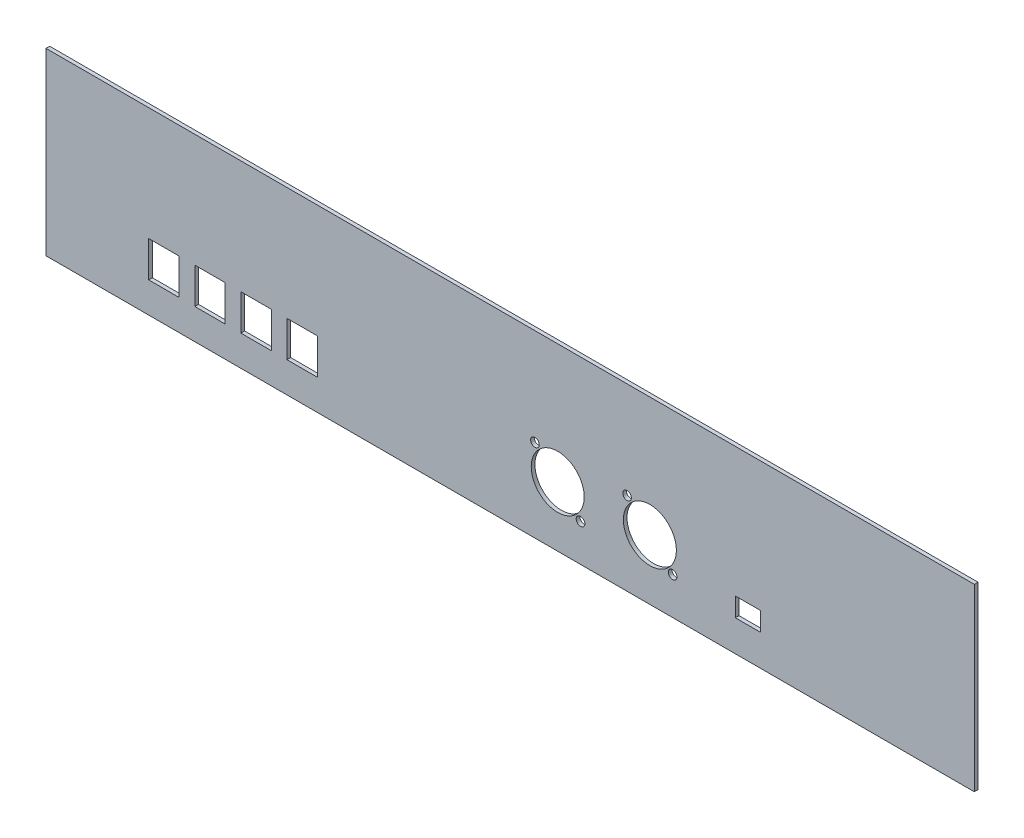
ISO-10303-21;
HEADER;
FILE_DESCRIPTION(('STEP AP214'),'2;1');
FILE_NAME('part.step','',(''),(''),'','','');
FILE_SCHEMA(('AUTOMOTIVE_DESIGN { 1 0 10303 214 1 1 1 1 }'));
ENDSEC;
DATA;
#1=APPLICATION_CONTEXT('core data for automotive mechanical design processes');
#2=APPLICATION_PROTOCOL_DEFINITION('international standard','automotive_design',2000,#1);
#3=PRODUCT_CONTEXT('',#1,'mechanical');
#4=PRODUCT('Part','Part','',(#3));
#5=PRODUCT_RELATED_PRODUCT_CATEGORY('part','',(#4));
#6=PRODUCT_DEFINITION_FORMATION('','',#4);
#7=PRODUCT_DEFINITION_CONTEXT('part definition',#1,'design');
#8=PRODUCT_DEFINITION('design','',#6,#7);
#9=PRODUCT_DEFINITION_SHAPE('','',#8);
#10=(LENGTH_UNIT() NAMED_UNIT(*) SI_UNIT(.MILLI.,.METRE.));
#11=(NAMED_UNIT(*) PLANE_ANGLE_UNIT() SI_UNIT($,.RADIAN.));
#12=(NAMED_UNIT(*) SI_UNIT($,.STERADIAN.) SOLID_ANGLE_UNIT());
#13=UNCERTAINTY_MEASURE_WITH_UNIT(LENGTH_MEASURE(1.E-05),#10,'distance_accuracy_value','');
#14=(GEOMETRIC_REPRESENTATION_CONTEXT(3) GLOBAL_UNCERTAINTY_ASSIGNED_CONTEXT((#13)) GLOBAL_UNIT_ASSIGNED_CONTEXT((#10,
#11,#12)) REPRESENTATION_CONTEXT('',''));
#15=CARTESIAN_POINT('',(0.,0.,0.));
#16=DIRECTION('',(0.,0.,1.));
#17=DIRECTION('',(1.,0.,0.));
#18=AXIS2_PLACEMENT_3D('',#15,#16,#17);
#19=CARTESIAN_POINT('',(0.,0.,1.6));
#20=DIRECTION('',(0.,0.,-1.));
#21=DIRECTION('',(-1.,0.,0.));
#22=AXIS2_PLACEMENT_3D('',#19,#20,#21);
#23=PLANE('',#22);
#24=DIRECTION('',(1.,0.,0.));
#25=VECTOR('',#24,1.);
#26=CARTESIAN_POINT('',(44.6,28.8,1.6));
#27=LINE('',#26,#25);
#28=CARTESIAN_POINT('',(44.6,28.8,1.6));
#29=VERTEX_POINT('',#28);
#30=CARTESIAN_POINT('',(57.8,28.8,1.6));
#31=VERTEX_POINT('',#30);
#32=EDGE_CURVE('E231',#29,#31,#27,.T.);
#33=ORIENTED_EDGE('',*,*,#32,.T.);
#34=DIRECTION('',(0.,-1.,0.));
#35=VECTOR('',#34,1.);
#36=CARTESIAN_POINT('',(57.8,28.8,1.6));
#37=LINE('',#36,#35);
#38=CARTESIAN_POINT('',(57.8,13.25,1.6));
#39=VERTEX_POINT('',#38);
#40=EDGE_CURVE('E227',#31,#39,#37,.T.);
#41=ORIENTED_EDGE('',*,*,#40,.T.);
#42=DIRECTION('',(-1.,0.,0.));
#43=VECTOR('',#42,1.);
#44=CARTESIAN_POINT('',(44.6,13.25,1.6));
#45=LINE('',#44,#43);
#46=CARTESIAN_POINT('',(44.6,13.25,1.6));
#47=VERTEX_POINT('',#46);
#48=EDGE_CURVE('E230',#39,#47,#45,.T.);
#49=ORIENTED_EDGE('',*,*,#48,.T.);
#50=DIRECTION('',(0.,1.,0.));
#51=VECTOR('',#50,1.);
#52=CARTESIAN_POINT('',(44.6,28.8,1.6));
#53=LINE('',#52,#51);
#54=EDGE_CURVE('E234',#47,#29,#53,.T.);
#55=ORIENTED_EDGE('',*,*,#54,.T.);
#56=EDGE_LOOP('',(#33,#41,#49,#55));
#57=FACE_BOUND('',#56,.T.);
#58=DIRECTION('',(1.,0.,0.));
#59=VECTOR('',#58,1.);
#60=CARTESIAN_POINT('',(84.6,28.8,1.6));
#61=LINE('',#60,#59);
#62=CARTESIAN_POINT('',(84.6,28.8,1.6));
#63=VERTEX_POINT('',#62);
#64=CARTESIAN_POINT('',(97.8,28.8,1.6));
#65=VERTEX_POINT('',#64);
#66=EDGE_CURVE('E299',#63,#65,#61,.T.);
#67=ORIENTED_EDGE('',*,*,#66,.T.);
#68=DIRECTION('',(0.,-1.,0.));
#69=VECTOR('',#68,1.);
#70=CARTESIAN_POINT('',(97.8,28.8,1.6));
#71=LINE('',#70,#69);
#72=CARTESIAN_POINT('',(97.8,13.25,1.6));
#73=VERTEX_POINT('',#72);
#74=EDGE_CURVE('E295',#65,#73,#71,.T.);
#75=ORIENTED_EDGE('',*,*,#74,.T.);
#76=DIRECTION('',(-1.,0.,0.));
#77=VECTOR('',#76,1.);
#78=CARTESIAN_POINT('',(84.6,13.25,1.6));
#79=LINE('',#78,#77);
#80=CARTESIAN_POINT('',(84.6,13.25,1.6));
#81=VERTEX_POINT('',#80);
#82=EDGE_CURVE('E298',#73,#81,#79,.T.);
#83=ORIENTED_EDGE('',*,*,#82,.T.);
#84=DIRECTION('',(0.,1.,0.));
#85=VECTOR('',#84,1.);
#86=CARTESIAN_POINT('',(84.6,28.8,1.6));
#87=LINE('',#86,#85);
#88=EDGE_CURVE('E275',#81,#63,#87,.T.);
#89=ORIENTED_EDGE('',*,*,#88,.T.);
#90=EDGE_LOOP('',(#67,#75,#83,#89));
#91=FACE_BOUND('',#90,.T.);
#92=DIRECTION('',(0.,-1.,0.));
#93=VECTOR('',#92,1.);
#94=CARTESIAN_POINT('',(0.,0.,1.6));
#95=LINE('',#94,#93);
#96=CARTESIAN_POINT('',(0.,78.,1.6));
#97=VERTEX_POINT('',#96);
#98=CARTESIAN_POINT('',(0.,0.,1.6));
#99=VERTEX_POINT('',#98);
#100=EDGE_CURVE('E397',#97,#99,#95,.T.);
#101=ORIENTED_EDGE('',*,*,#100,.T.);
#102=DIRECTION('',(1.,0.,0.));
#103=VECTOR('',#102,1.);
#104=CARTESIAN_POINT('',(0.,0.,1.6));
#105=LINE('',#104,#103);
#106=CARTESIAN_POINT('',(403.,0.,1.6));
#107=VERTEX_POINT('',#106);
#108=EDGE_CURVE('E400',#99,#107,#105,.T.);
#109=ORIENTED_EDGE('',*,*,#108,.T.);
#110=DIRECTION('',(0.,1.,0.));
#111=VECTOR('',#110,1.);
#112=CARTESIAN_POINT('',(403.,0.,1.6));
#113=LINE('',#112,#111);
#114=CARTESIAN_POINT('',(403.,78.,1.6));
#115=VERTEX_POINT('',#114);
#116=EDGE_CURVE('E403',#107,#115,#113,.T.);
#117=ORIENTED_EDGE('',*,*,#116,.T.);
#118=DIRECTION('',(-1.,0.,0.));
#119=VECTOR('',#118,1.);
#120=CARTESIAN_POINT('',(0.,78.,1.6));
#121=LINE('',#120,#119);
#122=EDGE_CURVE('E405',#115,#97,#121,.T.);
#123=ORIENTED_EDGE('',*,*,#122,.T.);
#124=EDGE_LOOP('',(#101,#109,#117,#123));
#125=FACE_BOUND('',#124,.T.);
#126=CARTESIAN_POINT('',(222.15,26.1,1.6));
#127=DIRECTION('',(0.,0.,-1.));
#128=DIRECTION('',(-1.,0.,0.));
#129=AXIS2_PLACEMENT_3D('',#126,#127,#128);
#130=CIRCLE('',#129,11.5);
#131=CARTESIAN_POINT('',(210.65,26.1,1.6));
#132=VERTEX_POINT('',#131);
#133=EDGE_CURVE('E393',#132,#132,#130,.T.);
#134=ORIENTED_EDGE('',*,*,#133,.T.);
#135=EDGE_LOOP('',(#134));
#136=FACE_BOUND('',#135,.T.);
#137=CARTESIAN_POINT('',(272.05,16.2,1.6));
#138=DIRECTION('',(0.,0.,-1.));
#139=DIRECTION('',(-1.,0.,0.));
#140=AXIS2_PLACEMENT_3D('',#137,#138,#139);
#141=CIRCLE('',#140,1.87499999999999);
#142=CARTESIAN_POINT('',(270.175,16.2,1.6));
#143=VERTEX_POINT('',#142);
#144=EDGE_CURVE('E363',#143,#143,#141,.T.);
#145=ORIENTED_EDGE('',*,*,#144,.T.);
#146=EDGE_LOOP('',(#145));
#147=FACE_BOUND('',#146,.T.);
#148=CARTESIAN_POINT('',(262.15,26.1,1.6));
#149=DIRECTION('',(0.,0.,-1.));
#150=DIRECTION('',(-1.,0.,0.));
#151=AXIS2_PLACEMENT_3D('',#148,#149,#150);
#152=CIRCLE('',#151,11.5);
#153=CARTESIAN_POINT('',(250.65,26.1,1.6));
#154=VERTEX_POINT('',#153);
#155=EDGE_CURVE('E378',#154,#154,#152,.T.);
#156=ORIENTED_EDGE('',*,*,#155,.T.);
#157=EDGE_LOOP('',(#156));
#158=FACE_BOUND('',#157,.T.);
#159=CARTESIAN_POINT('',(252.25,36.,1.6));
#160=DIRECTION('',(0.,0.,-1.));
#161=DIRECTION('',(-1.,0.,0.));
#162=AXIS2_PLACEMENT_3D('',#159,#160,#161);
#163=CIRCLE('',#162,1.87499999999999);
#164=CARTESIAN_POINT('',(250.375,36.,1.6));
#165=VERTEX_POINT('',#164);
#166=EDGE_CURVE('E383',#165,#165,#163,.T.);
#167=ORIENTED_EDGE('',*,*,#166,.T.);
#168=EDGE_LOOP('',(#167));
#169=FACE_BOUND('',#168,.T.);
#170=CARTESIAN_POINT('',(232.05,16.2,1.6));
#171=DIRECTION('',(0.,0.,-1.));
#172=DIRECTION('',(-1.,0.,0.));
#173=AXIS2_PLACEMENT_3D('',#170,#171,#172);
#174=CIRCLE('',#173,1.87499999999999);
#175=CARTESIAN_POINT('',(230.175,16.2,1.6));
#176=VERTEX_POINT('',#175);
#177=EDGE_CURVE('E371',#176,#176,#174,.T.);
#178=ORIENTED_EDGE('',*,*,#177,.T.);
#179=EDGE_LOOP('',(#178));
#180=FACE_BOUND('',#179,.T.);
#181=CARTESIAN_POINT('',(212.25,36.,1.6));
#182=DIRECTION('',(0.,0.,-1.));
#183=DIRECTION('',(-1.,0.,0.));
#184=AXIS2_PLACEMENT_3D('',#181,#182,#183);
#185=CIRCLE('',#184,1.87499999999999);
#186=CARTESIAN_POINT('',(210.375,36.,1.6));
#187=VERTEX_POINT('',#186);
#188=EDGE_CURVE('E370',#187,#187,#185,.T.);
#189=ORIENTED_EDGE('',*,*,#188,.T.);
#190=EDGE_LOOP('',(#189));
#191=FACE_BOUND('',#190,.T.);
#192=DIRECTION('',(1.,0.,0.));
#193=VECTOR('',#192,1.);
#194=CARTESIAN_POINT('',(104.6,28.8,1.6));
#195=LINE('',#194,#193);
#196=CARTESIAN_POINT('',(104.6,28.8,1.6));
#197=VERTEX_POINT('',#196);
#198=CARTESIAN_POINT('',(117.8,28.8,1.6));
#199=VERTEX_POINT('',#198);
#200=EDGE_CURVE('E332',#197,#199,#195,.T.);
#201=ORIENTED_EDGE('',*,*,#200,.T.);
#202=DIRECTION('',(0.,-1.,0.));
#203=VECTOR('',#202,1.);
#204=CARTESIAN_POINT('',(117.8,28.8,1.6));
#205=LINE('',#204,#203);
#206=CARTESIAN_POINT('',(117.8,13.25,1.6));
#207=VERTEX_POINT('',#206);
#208=EDGE_CURVE('E328',#199,#207,#205,.T.);
#209=ORIENTED_EDGE('',*,*,#208,.T.);
#210=DIRECTION('',(-1.,0.,0.));
#211=VECTOR('',#210,1.);
#212=CARTESIAN_POINT('',(104.6,13.25,1.6));
#213=LINE('',#212,#211);
#214=CARTESIAN_POINT('',(104.6,13.25,1.6));
#215=VERTEX_POINT('',#214);
#216=EDGE_CURVE('E331',#207,#215,#213,.T.);
#217=ORIENTED_EDGE('',*,*,#216,.T.);
#218=DIRECTION('',(0.,1.,0.));
#219=VECTOR('',#218,1.);
#220=CARTESIAN_POINT('',(104.6,28.8,1.6));
#221=LINE('',#220,#219);
#222=EDGE_CURVE('E308',#215,#197,#221,.T.);
#223=ORIENTED_EDGE('',*,*,#222,.T.);
#224=EDGE_LOOP('',(#201,#209,#217,#223));
#225=FACE_BOUND('',#224,.T.);
#226=DIRECTION('',(1.,0.,0.));
#227=VECTOR('',#226,1.);
#228=CARTESIAN_POINT('',(64.6,28.8,1.6));
#229=LINE('',#228,#227);
#230=CARTESIAN_POINT('',(64.6,28.8,1.6));
#231=VERTEX_POINT('',#230);
#232=CARTESIAN_POINT('',(77.8,28.8,1.6));
#233=VERTEX_POINT('',#232);
#234=EDGE_CURVE('E266',#231,#233,#229,.T.);
#235=ORIENTED_EDGE('',*,*,#234,.T.);
#236=DIRECTION('',(0.,-1.,0.));
#237=VECTOR('',#236,1.);
#238=CARTESIAN_POINT('',(77.8,28.8,1.6));
#239=LINE('',#238,#237);
#240=CARTESIAN_POINT('',(77.8,13.25,1.6));
#241=VERTEX_POINT('',#240);
#242=EDGE_CURVE('E262',#233,#241,#239,.T.);
#243=ORIENTED_EDGE('',*,*,#242,.T.);
#244=DIRECTION('',(-1.,0.,0.));
#245=VECTOR('',#244,1.);
#246=CARTESIAN_POINT('',(64.6,13.25,1.6));
#247=LINE('',#246,#245);
#248=CARTESIAN_POINT('',(64.6,13.25,1.6));
#249=VERTEX_POINT('',#248);
#250=EDGE_CURVE('E265',#241,#249,#247,.T.);
#251=ORIENTED_EDGE('',*,*,#250,.T.);
#252=DIRECTION('',(0.,1.,0.));
#253=VECTOR('',#252,1.);
#254=CARTESIAN_POINT('',(64.6,28.8,1.6));
#255=LINE('',#254,#253);
#256=EDGE_CURVE('E242',#249,#231,#255,.T.);
#257=ORIENTED_EDGE('',*,*,#256,.T.);
#258=EDGE_LOOP('',(#235,#243,#251,#257));
#259=FACE_BOUND('',#258,.T.);
#260=DIRECTION('',(1.,0.,0.));
#261=VECTOR('',#260,1.);
#262=CARTESIAN_POINT('',(299.25,21.75,1.6));
#263=LINE('',#262,#261);
#264=CARTESIAN_POINT('',(299.25,21.75,1.6));
#265=VERTEX_POINT('',#264);
#266=CARTESIAN_POINT('',(310.1,21.75,1.6));
#267=VERTEX_POINT('',#266);
#268=EDGE_CURVE('E223',#265,#267,#263,.T.);
#269=ORIENTED_EDGE('',*,*,#268,.T.);
#270=DIRECTION('',(0.,-1.,0.));
#271=VECTOR('',#270,1.);
#272=CARTESIAN_POINT('',(310.1,21.75,1.6));
#273=LINE('',#272,#271);
#274=CARTESIAN_POINT('',(310.1,13.55,1.6));
#275=VERTEX_POINT('',#274);
#276=EDGE_CURVE('E226',#267,#275,#273,.T.);
#277=ORIENTED_EDGE('',*,*,#276,.T.);
#278=DIRECTION('',(-1.,0.,0.));
#279=VECTOR('',#278,1.);
#280=CARTESIAN_POINT('',(299.25,13.55,1.6));
#281=LINE('',#280,#279);
#282=CARTESIAN_POINT('',(299.25,13.55,1.6));
#283=VERTEX_POINT('',#282);
#284=EDGE_CURVE('E197',#275,#283,#281,.T.);
#285=ORIENTED_EDGE('',*,*,#284,.T.);
#286=DIRECTION('',(0.,1.,0.));
#287=VECTOR('',#286,1.);
#288=CARTESIAN_POINT('',(299.25,21.75,1.6));
#289=LINE('',#288,#287);
#290=EDGE_CURVE('E341',#283,#265,#289,.T.);
#291=ORIENTED_EDGE('',*,*,#290,.T.);
#292=EDGE_LOOP('',(#269,#277,#285,#291));
#293=FACE_BOUND('',#292,.T.);
#294=ADVANCED_FACE('F33',(#57,#91,#125,#136,#147,#158,#169,#180,#191,#225,#259,#293),#23,.F.);
#295=CARTESIAN_POINT('',(0.,0.,0.));
#296=DIRECTION('',(0.,0.,-1.));
#297=DIRECTION('',(-1.,0.,0.));
#298=AXIS2_PLACEMENT_3D('',#295,#296,#297);
#299=PLANE('',#298);
#300=CARTESIAN_POINT('',(212.25,36.,0.));
#301=DIRECTION('',(0.,0.,1.));
#302=DIRECTION('',(1.,0.,0.));
#303=AXIS2_PLACEMENT_3D('',#300,#301,#302);
#304=CIRCLE('',#303,1.87499999999999);
#305=CARTESIAN_POINT('',(214.125,36.,0.));
#306=VERTEX_POINT('',#305);
#307=EDGE_CURVE('E367',#306,#306,#304,.T.);
#308=ORIENTED_EDGE('',*,*,#307,.T.);
#309=EDGE_LOOP('',(#308));
#310=FACE_BOUND('',#309,.T.);
#311=CARTESIAN_POINT('',(232.05,16.2,0.));
#312=DIRECTION('',(0.,0.,1.));
#313=DIRECTION('',(1.,0.,0.));
#314=AXIS2_PLACEMENT_3D('',#311,#312,#313);
#315=CIRCLE('',#314,1.87499999999999);
#316=CARTESIAN_POINT('',(233.925,16.2,0.));
#317=VERTEX_POINT('',#316);
#318=EDGE_CURVE('E375',#317,#317,#315,.T.);
#319=ORIENTED_EDGE('',*,*,#318,.T.);
#320=EDGE_LOOP('',(#319));
#321=FACE_BOUND('',#320,.T.);
#322=CARTESIAN_POINT('',(252.25,36.,0.));
#323=DIRECTION('',(0.,0.,1.));
#324=DIRECTION('',(1.,0.,0.));
#325=AXIS2_PLACEMENT_3D('',#322,#323,#324);
#326=CIRCLE('',#325,1.87499999999999);
#327=CARTESIAN_POINT('',(254.125,36.,0.));
#328=VERTEX_POINT('',#327);
#329=EDGE_CURVE('E366',#328,#328,#326,.T.);
#330=ORIENTED_EDGE('',*,*,#329,.T.);
#331=EDGE_LOOP('',(#330));
#332=FACE_BOUND('',#331,.T.);
#333=CARTESIAN_POINT('',(262.15,26.1,0.));
#334=DIRECTION('',(0.,0.,1.));
#335=DIRECTION('',(1.,0.,0.));
#336=AXIS2_PLACEMENT_3D('',#333,#334,#335);
#337=CIRCLE('',#336,11.5);
#338=CARTESIAN_POINT('',(273.65,26.1,0.));
#339=VERTEX_POINT('',#338);
#340=EDGE_CURVE('E386',#339,#339,#337,.T.);
#341=ORIENTED_EDGE('',*,*,#340,.T.);
#342=EDGE_LOOP('',(#341));
#343=FACE_BOUND('',#342,.T.);
#344=CARTESIAN_POINT('',(272.05,16.2,0.));
#345=DIRECTION('',(0.,0.,1.));
#346=DIRECTION('',(1.,0.,0.));
#347=AXIS2_PLACEMENT_3D('',#344,#345,#346);
#348=CIRCLE('',#347,1.87499999999999);
#349=CARTESIAN_POINT('',(273.925,16.2,0.));
#350=VERTEX_POINT('',#349);
#351=EDGE_CURVE('E237',#350,#350,#348,.T.);
#352=ORIENTED_EDGE('',*,*,#351,.T.);
#353=EDGE_LOOP('',(#352));
#354=FACE_BOUND('',#353,.T.);
#355=CARTESIAN_POINT('',(222.15,26.1,0.));
#356=DIRECTION('',(0.,0.,1.));
#357=DIRECTION('',(1.,0.,0.));
#358=AXIS2_PLACEMENT_3D('',#355,#356,#357);
#359=CIRCLE('',#358,11.5);
#360=CARTESIAN_POINT('',(233.65,26.1,0.));
#361=VERTEX_POINT('',#360);
#362=EDGE_CURVE('E374',#361,#361,#359,.T.);
#363=ORIENTED_EDGE('',*,*,#362,.T.);
#364=EDGE_LOOP('',(#363));
#365=FACE_BOUND('',#364,.T.);
#366=DIRECTION('',(0.,-1.,0.));
#367=VECTOR('',#366,1.);
#368=CARTESIAN_POINT('',(0.,0.,0.));
#369=LINE('',#368,#367);
#370=CARTESIAN_POINT('',(0.,78.,0.));
#371=VERTEX_POINT('',#370);
#372=CARTESIAN_POINT('',(0.,0.,0.));
#373=VERTEX_POINT('',#372);
#374=EDGE_CURVE('E396',#371,#373,#369,.T.);
#375=ORIENTED_EDGE('',*,*,#374,.F.);
#376=DIRECTION('',(-1.,0.,0.));
#377=VECTOR('',#376,1.);
#378=CARTESIAN_POINT('',(0.,78.,0.));
#379=LINE('',#378,#377);
#380=CARTESIAN_POINT('',(403.,78.,0.));
#381=VERTEX_POINT('',#380);
#382=EDGE_CURVE('E401',#381,#371,#379,.T.);
#383=ORIENTED_EDGE('',*,*,#382,.F.);
#384=DIRECTION('',(0.,1.,0.));
#385=VECTOR('',#384,1.);
#386=CARTESIAN_POINT('',(403.,0.,0.));
#387=LINE('',#386,#385);
#388=CARTESIAN_POINT('',(403.,0.,0.));
#389=VERTEX_POINT('',#388);
#390=EDGE_CURVE('E412',#389,#381,#387,.T.);
#391=ORIENTED_EDGE('',*,*,#390,.F.);
#392=DIRECTION('',(1.,0.,0.));
#393=VECTOR('',#392,1.);
#394=CARTESIAN_POINT('',(0.,0.,0.));
#395=LINE('',#394,#393);
#396=EDGE_CURVE('E410',#373,#389,#395,.T.);
#397=ORIENTED_EDGE('',*,*,#396,.F.);
#398=EDGE_LOOP('',(#375,#383,#391,#397));
#399=FACE_BOUND('',#398,.T.);
#400=DIRECTION('',(0.,1.,0.));
#401=VECTOR('',#400,1.);
#402=CARTESIAN_POINT('',(117.8,28.8,0.));
#403=LINE('',#402,#401);
#404=CARTESIAN_POINT('',(117.8,13.25,0.));
#405=VERTEX_POINT('',#404);
#406=CARTESIAN_POINT('',(117.8,28.8,0.));
#407=VERTEX_POINT('',#406);
#408=EDGE_CURVE('E344',#405,#407,#403,.T.);
#409=ORIENTED_EDGE('',*,*,#408,.T.);
#410=DIRECTION('',(-1.,0.,0.));
#411=VECTOR('',#410,1.);
#412=CARTESIAN_POINT('',(104.6,28.8,0.));
#413=LINE('',#412,#411);
#414=CARTESIAN_POINT('',(104.6,28.8,0.));
#415=VERTEX_POINT('',#414);
#416=EDGE_CURVE('E347',#407,#415,#413,.T.);
#417=ORIENTED_EDGE('',*,*,#416,.T.);
#418=DIRECTION('',(0.,-1.,0.));
#419=VECTOR('',#418,1.);
#420=CARTESIAN_POINT('',(104.6,28.8,0.));
#421=LINE('',#420,#419);
#422=CARTESIAN_POINT('',(104.6,13.25,0.));
#423=VERTEX_POINT('',#422);
#424=EDGE_CURVE('E337',#415,#423,#421,.T.);
#425=ORIENTED_EDGE('',*,*,#424,.T.);
#426=DIRECTION('',(1.,0.,0.));
#427=VECTOR('',#426,1.);
#428=CARTESIAN_POINT('',(104.6,13.25,0.));
#429=LINE('',#428,#427);
#430=EDGE_CURVE('E340',#423,#405,#429,.T.);
#431=ORIENTED_EDGE('',*,*,#430,.T.);
#432=EDGE_LOOP('',(#409,#417,#425,#431));
#433=FACE_BOUND('',#432,.T.);
#434=DIRECTION('',(0.,1.,0.));
#435=VECTOR('',#434,1.);
#436=CARTESIAN_POINT('',(97.8,28.8,0.));
#437=LINE('',#436,#435);
#438=CARTESIAN_POINT('',(97.8,13.25,0.));
#439=VERTEX_POINT('',#438);
#440=CARTESIAN_POINT('',(97.8,28.8,0.));
#441=VERTEX_POINT('',#440);
#442=EDGE_CURVE('E311',#439,#441,#437,.T.);
#443=ORIENTED_EDGE('',*,*,#442,.T.);
#444=DIRECTION('',(-1.,0.,0.));
#445=VECTOR('',#444,1.);
#446=CARTESIAN_POINT('',(84.6,28.8,0.));
#447=LINE('',#446,#445);
#448=CARTESIAN_POINT('',(84.6,28.8,0.));
#449=VERTEX_POINT('',#448);
#450=EDGE_CURVE('E314',#441,#449,#447,.T.);
#451=ORIENTED_EDGE('',*,*,#450,.T.);
#452=DIRECTION('',(0.,-1.,0.));
#453=VECTOR('',#452,1.);
#454=CARTESIAN_POINT('',(84.6,28.8,0.));
#455=LINE('',#454,#453);
#456=CARTESIAN_POINT('',(84.6,13.25,0.));
#457=VERTEX_POINT('',#456);
#458=EDGE_CURVE('E304',#449,#457,#455,.T.);
#459=ORIENTED_EDGE('',*,*,#458,.T.);
#460=DIRECTION('',(1.,0.,0.));
#461=VECTOR('',#460,1.);
#462=CARTESIAN_POINT('',(84.6,13.25,0.));
#463=LINE('',#462,#461);
#464=EDGE_CURVE('E307',#457,#439,#463,.T.);
#465=ORIENTED_EDGE('',*,*,#464,.T.);
#466=EDGE_LOOP('',(#443,#451,#459,#465));
#467=FACE_BOUND('',#466,.T.);
#468=DIRECTION('',(0.,1.,0.));
#469=VECTOR('',#468,1.);
#470=CARTESIAN_POINT('',(77.8,28.8,0.));
#471=LINE('',#470,#469);
#472=CARTESIAN_POINT('',(77.8,13.25,0.));
#473=VERTEX_POINT('',#472);
#474=CARTESIAN_POINT('',(77.8,28.8,0.));
#475=VERTEX_POINT('',#474);
#476=EDGE_CURVE('E278',#473,#475,#471,.T.);
#477=ORIENTED_EDGE('',*,*,#476,.T.);
#478=DIRECTION('',(-1.,0.,0.));
#479=VECTOR('',#478,1.);
#480=CARTESIAN_POINT('',(64.6,28.8,0.));
#481=LINE('',#480,#479);
#482=CARTESIAN_POINT('',(64.6,28.8,0.));
#483=VERTEX_POINT('',#482);
#484=EDGE_CURVE('E281',#475,#483,#481,.T.);
#485=ORIENTED_EDGE('',*,*,#484,.T.);
#486=DIRECTION('',(0.,-1.,0.));
#487=VECTOR('',#486,1.);
#488=CARTESIAN_POINT('',(64.6,28.8,0.));
#489=LINE('',#488,#487);
#490=CARTESIAN_POINT('',(64.6,13.25,0.));
#491=VERTEX_POINT('',#490);
#492=EDGE_CURVE('E271',#483,#491,#489,.T.);
#493=ORIENTED_EDGE('',*,*,#492,.T.);
#494=DIRECTION('',(1.,0.,0.));
#495=VECTOR('',#494,1.);
#496=CARTESIAN_POINT('',(64.6,13.25,0.));
#497=LINE('',#496,#495);
#498=EDGE_CURVE('E274',#491,#473,#497,.T.);
#499=ORIENTED_EDGE('',*,*,#498,.T.);
#500=EDGE_LOOP('',(#477,#485,#493,#499));
#501=FACE_BOUND('',#500,.T.);
#502=DIRECTION('',(0.,1.,0.));
#503=VECTOR('',#502,1.);
#504=CARTESIAN_POINT('',(57.8,28.8,0.));
#505=LINE('',#504,#503);
#506=CARTESIAN_POINT('',(57.8,13.25,0.));
#507=VERTEX_POINT('',#506);
#508=CARTESIAN_POINT('',(57.8,28.8,0.));
#509=VERTEX_POINT('',#508);
#510=EDGE_CURVE('E245',#507,#509,#505,.T.);
#511=ORIENTED_EDGE('',*,*,#510,.T.);
#512=DIRECTION('',(-1.,0.,0.));
#513=VECTOR('',#512,1.);
#514=CARTESIAN_POINT('',(44.6,28.8,0.));
#515=LINE('',#514,#513);
#516=CARTESIAN_POINT('',(44.6,28.8,0.));
#517=VERTEX_POINT('',#516);
#518=EDGE_CURVE('E248',#509,#517,#515,.T.);
#519=ORIENTED_EDGE('',*,*,#518,.T.);
#520=DIRECTION('',(0.,-1.,0.));
#521=VECTOR('',#520,1.);
#522=CARTESIAN_POINT('',(44.6,28.8,0.));
#523=LINE('',#522,#521);
#524=CARTESIAN_POINT('',(44.6,13.25,0.));
#525=VERTEX_POINT('',#524);
#526=EDGE_CURVE('E238',#517,#525,#523,.T.);
#527=ORIENTED_EDGE('',*,*,#526,.T.);
#528=DIRECTION('',(1.,0.,0.));
#529=VECTOR('',#528,1.);
#530=CARTESIAN_POINT('',(44.6,13.25,0.));
#531=LINE('',#530,#529);
#532=EDGE_CURVE('E241',#525,#507,#531,.T.);
#533=ORIENTED_EDGE('',*,*,#532,.T.);
#534=EDGE_LOOP('',(#511,#519,#527,#533));
#535=FACE_BOUND('',#534,.T.);
#536=DIRECTION('',(0.,1.,0.));
#537=VECTOR('',#536,1.);
#538=CARTESIAN_POINT('',(310.1,21.75,0.));
#539=LINE('',#538,#537);
#540=CARTESIAN_POINT('',(310.1,13.55,0.));
#541=VERTEX_POINT('',#540);
#542=CARTESIAN_POINT('',(310.1,21.75,0.));
#543=VERTEX_POINT('',#542);
#544=EDGE_CURVE('E204',#541,#543,#539,.T.);
#545=ORIENTED_EDGE('',*,*,#544,.T.);
#546=DIRECTION('',(-1.,0.,0.));
#547=VECTOR('',#546,1.);
#548=CARTESIAN_POINT('',(299.25,21.75,0.));
#549=LINE('',#548,#547);
#550=CARTESIAN_POINT('',(299.25,21.75,0.));
#551=VERTEX_POINT('',#550);
#552=EDGE_CURVE('E210',#543,#551,#549,.T.);
#553=ORIENTED_EDGE('',*,*,#552,.T.);
#554=DIRECTION('',(0.,-1.,0.));
#555=VECTOR('',#554,1.);
#556=CARTESIAN_POINT('',(299.25,21.75,0.));
#557=LINE('',#556,#555);
#558=CARTESIAN_POINT('',(299.25,13.55,0.));
#559=VERTEX_POINT('',#558);
#560=EDGE_CURVE('E214',#551,#559,#557,.T.);
#561=ORIENTED_EDGE('',*,*,#560,.T.);
#562=DIRECTION('',(1.,0.,0.));
#563=VECTOR('',#562,1.);
#564=CARTESIAN_POINT('',(299.25,13.55,0.));
#565=LINE('',#564,#563);
#566=EDGE_CURVE('E56',#559,#541,#565,.T.);
#567=ORIENTED_EDGE('',*,*,#566,.T.);
#568=EDGE_LOOP('',(#545,#553,#561,#567));
#569=FACE_BOUND('',#568,.T.);
#570=ADVANCED_FACE('F213',(#310,#321,#332,#343,#354,#365,#399,#433,#467,#501,#535,#569),#299,.T.);
#571=CARTESIAN_POINT('',(0.,0.,1.6));
#572=DIRECTION('',(1.,0.,0.));
#573=DIRECTION('',(0.,0.,-1.));
#574=AXIS2_PLACEMENT_3D('',#571,#572,#573);
#575=PLANE('',#574);
#576=ORIENTED_EDGE('',*,*,#374,.T.);
#577=DIRECTION('',(0.,0.,-1.));
#578=VECTOR('',#577,1.);
#579=CARTESIAN_POINT('',(0.,0.,1.6));
#580=LINE('',#579,#578);
#581=EDGE_CURVE('E11',#99,#373,#580,.T.);
#582=ORIENTED_EDGE('',*,*,#581,.F.);
#583=ORIENTED_EDGE('',*,*,#100,.F.);
#584=DIRECTION('',(0.,0.,-1.));
#585=VECTOR('',#584,1.);
#586=CARTESIAN_POINT('',(0.,78.,1.6));
#587=LINE('',#586,#585);
#588=EDGE_CURVE('E407',#97,#371,#587,.T.);
#589=ORIENTED_EDGE('',*,*,#588,.T.);
#590=EDGE_LOOP('',(#576,#582,#583,#589));
#591=FACE_BOUND('',#590,.T.);
#592=ADVANCED_FACE('F35',(#591),#575,.F.);
#593=CARTESIAN_POINT('',(0.,0.,1.6));
#594=DIRECTION('',(0.,1.,0.));
#595=DIRECTION('',(0.,0.,1.));
#596=AXIS2_PLACEMENT_3D('',#593,#594,#595);
#597=PLANE('',#596);
#598=ORIENTED_EDGE('',*,*,#396,.T.);
#599=DIRECTION('',(0.,0.,-1.));
#600=VECTOR('',#599,1.);
#601=CARTESIAN_POINT('',(403.,0.,1.6));
#602=LINE('',#601,#600);
#603=EDGE_CURVE('E41',#107,#389,#602,.T.);
#604=ORIENTED_EDGE('',*,*,#603,.F.);
#605=ORIENTED_EDGE('',*,*,#108,.F.);
#606=ORIENTED_EDGE('',*,*,#581,.T.);
#607=EDGE_LOOP('',(#598,#604,#605,#606));
#608=FACE_BOUND('',#607,.T.);
#609=ADVANCED_FACE('F440',(#608),#597,.F.);
#610=CARTESIAN_POINT('',(403.,0.,1.6));
#611=DIRECTION('',(-1.,0.,0.));
#612=DIRECTION('',(0.,0.,1.));
#613=AXIS2_PLACEMENT_3D('',#610,#611,#612);
#614=PLANE('',#613);
#615=ORIENTED_EDGE('',*,*,#390,.T.);
#616=DIRECTION('',(0.,0.,-1.));
#617=VECTOR('',#616,1.);
#618=CARTESIAN_POINT('',(403.,78.,1.6));
#619=LINE('',#618,#617);
#620=EDGE_CURVE('E417',#115,#381,#619,.T.);
#621=ORIENTED_EDGE('',*,*,#620,.F.);
#622=ORIENTED_EDGE('',*,*,#116,.F.);
#623=ORIENTED_EDGE('',*,*,#603,.T.);
#624=EDGE_LOOP('',(#615,#621,#622,#623));
#625=FACE_BOUND('',#624,.T.);
#626=ADVANCED_FACE('F424',(#625),#614,.F.);
#627=CARTESIAN_POINT('',(0.,78.,1.6));
#628=DIRECTION('',(0.,-1.,0.));
#629=DIRECTION('',(0.,0.,-1.));
#630=AXIS2_PLACEMENT_3D('',#627,#628,#629);
#631=PLANE('',#630);
#632=ORIENTED_EDGE('',*,*,#382,.T.);
#633=ORIENTED_EDGE('',*,*,#588,.F.);
#634=ORIENTED_EDGE('',*,*,#122,.F.);
#635=ORIENTED_EDGE('',*,*,#620,.T.);
#636=EDGE_LOOP('',(#632,#633,#634,#635));
#637=FACE_BOUND('',#636,.T.);
#638=ADVANCED_FACE('F433',(#637),#631,.F.);
#639=CARTESIAN_POINT('',(222.15,26.1,34.1269119345812));
#640=DIRECTION('',(0.,0.,-1.));
#641=DIRECTION('',(-1.,0.,0.));
#642=AXIS2_PLACEMENT_3D('',#639,#640,#641);
#643=CYLINDRICAL_SURFACE('',#642,11.5);
#644=ORIENTED_EDGE('',*,*,#133,.F.);
#645=EDGE_LOOP('',(#644));
#646=FACE_BOUND('',#645,.T.);
#647=ORIENTED_EDGE('',*,*,#362,.F.);
#648=EDGE_LOOP('',(#647));
#649=FACE_BOUND('',#648,.T.);
#650=ADVANCED_FACE('F457',(#646,#649),#643,.F.);
#651=CARTESIAN_POINT('',(272.05,16.2,34.1269119345812));
#652=DIRECTION('',(0.,0.,-1.));
#653=DIRECTION('',(-1.,0.,0.));
#654=AXIS2_PLACEMENT_3D('',#651,#652,#653);
#655=CYLINDRICAL_SURFACE('',#654,1.87499999999999);
#656=ORIENTED_EDGE('',*,*,#144,.F.);
#657=EDGE_LOOP('',(#656));
#658=FACE_BOUND('',#657,.T.);
#659=ORIENTED_EDGE('',*,*,#351,.F.);
#660=EDGE_LOOP('',(#659));
#661=FACE_BOUND('',#660,.T.);
#662=ADVANCED_FACE('F464',(#658,#661),#655,.F.);
#663=CARTESIAN_POINT('',(262.15,26.1,34.1269119345812));
#664=DIRECTION('',(0.,0.,-1.));
#665=DIRECTION('',(-1.,0.,0.));
#666=AXIS2_PLACEMENT_3D('',#663,#664,#665);
#667=CYLINDRICAL_SURFACE('',#666,11.5);
#668=ORIENTED_EDGE('',*,*,#155,.F.);
#669=EDGE_LOOP('',(#668));
#670=FACE_BOUND('',#669,.T.);
#671=ORIENTED_EDGE('',*,*,#340,.F.);
#672=EDGE_LOOP('',(#671));
#673=FACE_BOUND('',#672,.T.);
#674=ADVANCED_FACE('F469',(#670,#673),#667,.F.);
#675=CARTESIAN_POINT('',(252.25,36.,34.1269119345812));
#676=DIRECTION('',(0.,0.,-1.));
#677=DIRECTION('',(-1.,0.,0.));
#678=AXIS2_PLACEMENT_3D('',#675,#676,#677);
#679=CYLINDRICAL_SURFACE('',#678,1.87499999999999);
#680=ORIENTED_EDGE('',*,*,#166,.F.);
#681=EDGE_LOOP('',(#680));
#682=FACE_BOUND('',#681,.T.);
#683=ORIENTED_EDGE('',*,*,#329,.F.);
#684=EDGE_LOOP('',(#683));
#685=FACE_BOUND('',#684,.T.);
#686=ADVANCED_FACE('F576',(#682,#685),#679,.F.);
#687=CARTESIAN_POINT('',(232.05,16.2,34.1269119345812));
#688=DIRECTION('',(0.,0.,-1.));
#689=DIRECTION('',(-1.,0.,0.));
#690=AXIS2_PLACEMENT_3D('',#687,#688,#689);
#691=CYLINDRICAL_SURFACE('',#690,1.87499999999999);
#692=ORIENTED_EDGE('',*,*,#177,.F.);
#693=EDGE_LOOP('',(#692));
#694=FACE_BOUND('',#693,.T.);
#695=ORIENTED_EDGE('',*,*,#318,.F.);
#696=EDGE_LOOP('',(#695));
#697=FACE_BOUND('',#696,.T.);
#698=ADVANCED_FACE('F572',(#694,#697),#691,.F.);
#699=CARTESIAN_POINT('',(212.25,36.,34.1269119345812));
#700=DIRECTION('',(0.,0.,-1.));
#701=DIRECTION('',(-1.,0.,0.));
#702=AXIS2_PLACEMENT_3D('',#699,#700,#701);
#703=CYLINDRICAL_SURFACE('',#702,1.87499999999999);
#704=ORIENTED_EDGE('',*,*,#188,.F.);
#705=EDGE_LOOP('',(#704));
#706=FACE_BOUND('',#705,.T.);
#707=ORIENTED_EDGE('',*,*,#307,.F.);
#708=EDGE_LOOP('',(#707));
#709=FACE_BOUND('',#708,.T.);
#710=ADVANCED_FACE('F558',(#706,#709),#703,.F.);
#711=CARTESIAN_POINT('',(104.6,28.8,21.9971198947303));
#712=DIRECTION('',(0.,-1.,0.));
#713=DIRECTION('',(1.,0.,0.));
#714=AXIS2_PLACEMENT_3D('',#711,#712,#713);
#715=PLANE('',#714);
#716=DIRECTION('',(0.,0.,-1.));
#717=VECTOR('',#716,1.);
#718=CARTESIAN_POINT('',(104.6,28.8,21.9971198947303));
#719=LINE('',#718,#717);
#720=EDGE_CURVE('E350',#197,#415,#719,.T.);
#721=ORIENTED_EDGE('',*,*,#720,.T.);
#722=ORIENTED_EDGE('',*,*,#416,.F.);
#723=DIRECTION('',(0.,0.,-1.));
#724=VECTOR('',#723,1.);
#725=CARTESIAN_POINT('',(117.8,28.8,21.9971198947303));
#726=LINE('',#725,#724);
#727=EDGE_CURVE('E352',#199,#407,#726,.T.);
#728=ORIENTED_EDGE('',*,*,#727,.F.);
#729=ORIENTED_EDGE('',*,*,#200,.F.);
#730=EDGE_LOOP('',(#721,#722,#728,#729));
#731=FACE_BOUND('',#730,.T.);
#732=ADVANCED_FACE('F554',(#731),#715,.T.);
#733=CARTESIAN_POINT('',(117.8,28.8,21.9971198947303));
#734=DIRECTION('',(-1.,0.,0.));
#735=DIRECTION('',(0.,0.,1.));
#736=AXIS2_PLACEMENT_3D('',#733,#734,#735);
#737=PLANE('',#736);
#738=ORIENTED_EDGE('',*,*,#727,.T.);
#739=ORIENTED_EDGE('',*,*,#408,.F.);
#740=DIRECTION('',(0.,0.,-1.));
#741=VECTOR('',#740,1.);
#742=CARTESIAN_POINT('',(117.8,13.25,21.9971198947303));
#743=LINE('',#742,#741);
#744=EDGE_CURVE('E354',#207,#405,#743,.T.);
#745=ORIENTED_EDGE('',*,*,#744,.F.);
#746=ORIENTED_EDGE('',*,*,#208,.F.);
#747=EDGE_LOOP('',(#738,#739,#745,#746));
#748=FACE_BOUND('',#747,.T.);
#749=ADVANCED_FACE('F557',(#748),#737,.T.);
#750=CARTESIAN_POINT('',(104.6,13.25,21.9971198947303));
#751=DIRECTION('',(0.,1.,0.));
#752=DIRECTION('',(0.,0.,1.));
#753=AXIS2_PLACEMENT_3D('',#750,#751,#752);
#754=PLANE('',#753);
#755=ORIENTED_EDGE('',*,*,#744,.T.);
#756=ORIENTED_EDGE('',*,*,#430,.F.);
#757=DIRECTION('',(0.,0.,-1.));
#758=VECTOR('',#757,1.);
#759=CARTESIAN_POINT('',(104.6,13.25,21.9971198947303));
#760=LINE('',#759,#758);
#761=EDGE_CURVE('E356',#215,#423,#760,.T.);
#762=ORIENTED_EDGE('',*,*,#761,.F.);
#763=ORIENTED_EDGE('',*,*,#216,.F.);
#764=EDGE_LOOP('',(#755,#756,#762,#763));
#765=FACE_BOUND('',#764,.T.);
#766=ADVANCED_FACE('F562',(#765),#754,.T.);
#767=CARTESIAN_POINT('',(104.6,28.8,21.9971198947303));
#768=DIRECTION('',(1.,0.,0.));
#769=DIRECTION('',(0.,1.,0.));
#770=AXIS2_PLACEMENT_3D('',#767,#768,#769);
#771=PLANE('',#770);
#772=ORIENTED_EDGE('',*,*,#761,.T.);
#773=ORIENTED_EDGE('',*,*,#424,.F.);
#774=ORIENTED_EDGE('',*,*,#720,.F.);
#775=ORIENTED_EDGE('',*,*,#222,.F.);
#776=EDGE_LOOP('',(#772,#773,#774,#775));
#777=FACE_BOUND('',#776,.T.);
#778=ADVANCED_FACE('F542',(#777),#771,.T.);
#779=CARTESIAN_POINT('',(84.6,28.8,21.9971198947303));
#780=DIRECTION('',(0.,-1.,0.));
#781=DIRECTION('',(1.,0.,0.));
#782=AXIS2_PLACEMENT_3D('',#779,#780,#781);
#783=PLANE('',#782);
#784=DIRECTION('',(0.,0.,-1.));
#785=VECTOR('',#784,1.);
#786=CARTESIAN_POINT('',(84.6,28.8,21.9971198947303));
#787=LINE('',#786,#785);
#788=EDGE_CURVE('E317',#63,#449,#787,.T.);
#789=ORIENTED_EDGE('',*,*,#788,.T.);
#790=ORIENTED_EDGE('',*,*,#450,.F.);
#791=DIRECTION('',(0.,0.,-1.));
#792=VECTOR('',#791,1.);
#793=CARTESIAN_POINT('',(97.8,28.8,21.9971198947303));
#794=LINE('',#793,#792);
#795=EDGE_CURVE('E319',#65,#441,#794,.T.);
#796=ORIENTED_EDGE('',*,*,#795,.F.);
#797=ORIENTED_EDGE('',*,*,#66,.F.);
#798=EDGE_LOOP('',(#789,#790,#796,#797));
#799=FACE_BOUND('',#798,.T.);
#800=ADVANCED_FACE('F538',(#799),#783,.T.);
#801=CARTESIAN_POINT('',(97.8,28.8,21.9971198947303));
#802=DIRECTION('',(-1.,0.,0.));
#803=DIRECTION('',(0.,0.,1.));
#804=AXIS2_PLACEMENT_3D('',#801,#802,#803);
#805=PLANE('',#804);
#806=ORIENTED_EDGE('',*,*,#795,.T.);
#807=ORIENTED_EDGE('',*,*,#442,.F.);
#808=DIRECTION('',(0.,0.,-1.));
#809=VECTOR('',#808,1.);
#810=CARTESIAN_POINT('',(97.8,13.25,21.9971198947303));
#811=LINE('',#810,#809);
#812=EDGE_CURVE('E321',#73,#439,#811,.T.);
#813=ORIENTED_EDGE('',*,*,#812,.F.);
#814=ORIENTED_EDGE('',*,*,#74,.F.);
#815=EDGE_LOOP('',(#806,#807,#813,#814));
#816=FACE_BOUND('',#815,.T.);
#817=ADVANCED_FACE('F541',(#816),#805,.T.);
#818=CARTESIAN_POINT('',(84.6,13.25,21.9971198947303));
#819=DIRECTION('',(0.,1.,0.));
#820=DIRECTION('',(0.,0.,1.));
#821=AXIS2_PLACEMENT_3D('',#818,#819,#820);
#822=PLANE('',#821);
#823=ORIENTED_EDGE('',*,*,#812,.T.);
#824=ORIENTED_EDGE('',*,*,#464,.F.);
#825=DIRECTION('',(0.,0.,-1.));
#826=VECTOR('',#825,1.);
#827=CARTESIAN_POINT('',(84.6,13.25,21.9971198947303));
#828=LINE('',#827,#826);
#829=EDGE_CURVE('E323',#81,#457,#828,.T.);
#830=ORIENTED_EDGE('',*,*,#829,.F.);
#831=ORIENTED_EDGE('',*,*,#82,.F.);
#832=EDGE_LOOP('',(#823,#824,#830,#831));
#833=FACE_BOUND('',#832,.T.);
#834=ADVANCED_FACE('F546',(#833),#822,.T.);
#835=CARTESIAN_POINT('',(84.6,28.8,21.9971198947303));
#836=DIRECTION('',(1.,0.,0.));
#837=DIRECTION('',(0.,1.,0.));
#838=AXIS2_PLACEMENT_3D('',#835,#836,#837);
#839=PLANE('',#838);
#840=ORIENTED_EDGE('',*,*,#829,.T.);
#841=ORIENTED_EDGE('',*,*,#458,.F.);
#842=ORIENTED_EDGE('',*,*,#788,.F.);
#843=ORIENTED_EDGE('',*,*,#88,.F.);
#844=EDGE_LOOP('',(#840,#841,#842,#843));
#845=FACE_BOUND('',#844,.T.);
#846=ADVANCED_FACE('F526',(#845),#839,.T.);
#847=CARTESIAN_POINT('',(64.6,28.8,21.9971198947303));
#848=DIRECTION('',(0.,-1.,0.));
#849=DIRECTION('',(1.,0.,0.));
#850=AXIS2_PLACEMENT_3D('',#847,#848,#849);
#851=PLANE('',#850);
#852=DIRECTION('',(0.,0.,-1.));
#853=VECTOR('',#852,1.);
#854=CARTESIAN_POINT('',(64.6,28.8,21.9971198947303));
#855=LINE('',#854,#853);
#856=EDGE_CURVE('E284',#231,#483,#855,.T.);
#857=ORIENTED_EDGE('',*,*,#856,.T.);
#858=ORIENTED_EDGE('',*,*,#484,.F.);
#859=DIRECTION('',(0.,0.,-1.));
#860=VECTOR('',#859,1.);
#861=CARTESIAN_POINT('',(77.8,28.8,21.9971198947303));
#862=LINE('',#861,#860);
#863=EDGE_CURVE('E286',#233,#475,#862,.T.);
#864=ORIENTED_EDGE('',*,*,#863,.F.);
#865=ORIENTED_EDGE('',*,*,#234,.F.);
#866=EDGE_LOOP('',(#857,#858,#864,#865));
#867=FACE_BOUND('',#866,.T.);
#868=ADVANCED_FACE('F522',(#867),#851,.T.);
#869=CARTESIAN_POINT('',(77.8,28.8,21.9971198947303));
#870=DIRECTION('',(-1.,0.,0.));
#871=DIRECTION('',(0.,0.,1.));
#872=AXIS2_PLACEMENT_3D('',#869,#870,#871);
#873=PLANE('',#872);
#874=ORIENTED_EDGE('',*,*,#863,.T.);
#875=ORIENTED_EDGE('',*,*,#476,.F.);
#876=DIRECTION('',(0.,0.,-1.));
#877=VECTOR('',#876,1.);
#878=CARTESIAN_POINT('',(77.8,13.25,21.9971198947303));
#879=LINE('',#878,#877);
#880=EDGE_CURVE('E288',#241,#473,#879,.T.);
#881=ORIENTED_EDGE('',*,*,#880,.F.);
#882=ORIENTED_EDGE('',*,*,#242,.F.);
#883=EDGE_LOOP('',(#874,#875,#881,#882));
#884=FACE_BOUND('',#883,.T.);
#885=ADVANCED_FACE('F525',(#884),#873,.T.);
#886=CARTESIAN_POINT('',(64.6,13.25,21.9971198947303));
#887=DIRECTION('',(0.,1.,0.));
#888=DIRECTION('',(0.,0.,1.));
#889=AXIS2_PLACEMENT_3D('',#886,#887,#888);
#890=PLANE('',#889);
#891=ORIENTED_EDGE('',*,*,#880,.T.);
#892=ORIENTED_EDGE('',*,*,#498,.F.);
#893=DIRECTION('',(0.,0.,-1.));
#894=VECTOR('',#893,1.);
#895=CARTESIAN_POINT('',(64.6,13.25,21.9971198947303));
#896=LINE('',#895,#894);
#897=EDGE_CURVE('E290',#249,#491,#896,.T.);
#898=ORIENTED_EDGE('',*,*,#897,.F.);
#899=ORIENTED_EDGE('',*,*,#250,.F.);
#900=EDGE_LOOP('',(#891,#892,#898,#899));
#901=FACE_BOUND('',#900,.T.);
#902=ADVANCED_FACE('F530',(#901),#890,.T.);
#903=CARTESIAN_POINT('',(64.6,28.8,21.9971198947303));
#904=DIRECTION('',(1.,0.,0.));
#905=DIRECTION('',(0.,1.,0.));
#906=AXIS2_PLACEMENT_3D('',#903,#904,#905);
#907=PLANE('',#906);
#908=ORIENTED_EDGE('',*,*,#897,.T.);
#909=ORIENTED_EDGE('',*,*,#492,.F.);
#910=ORIENTED_EDGE('',*,*,#856,.F.);
#911=ORIENTED_EDGE('',*,*,#256,.F.);
#912=EDGE_LOOP('',(#908,#909,#910,#911));
#913=FACE_BOUND('',#912,.T.);
#914=ADVANCED_FACE('F509',(#913),#907,.T.);
#915=CARTESIAN_POINT('',(44.6,28.8,21.9971198947303));
#916=DIRECTION('',(0.,-1.,0.));
#917=DIRECTION('',(1.,0.,0.));
#918=AXIS2_PLACEMENT_3D('',#915,#916,#917);
#919=PLANE('',#918);
#920=DIRECTION('',(0.,0.,-1.));
#921=VECTOR('',#920,1.);
#922=CARTESIAN_POINT('',(44.6,28.8,21.9971198947303));
#923=LINE('',#922,#921);
#924=EDGE_CURVE('E251',#29,#517,#923,.T.);
#925=ORIENTED_EDGE('',*,*,#924,.T.);
#926=ORIENTED_EDGE('',*,*,#518,.F.);
#927=DIRECTION('',(0.,0.,-1.));
#928=VECTOR('',#927,1.);
#929=CARTESIAN_POINT('',(57.8,28.8,21.9971198947303));
#930=LINE('',#929,#928);
#931=EDGE_CURVE('E253',#31,#509,#930,.T.);
#932=ORIENTED_EDGE('',*,*,#931,.F.);
#933=ORIENTED_EDGE('',*,*,#32,.F.);
#934=EDGE_LOOP('',(#925,#926,#932,#933));
#935=FACE_BOUND('',#934,.T.);
#936=ADVANCED_FACE('F505',(#935),#919,.T.);
#937=CARTESIAN_POINT('',(57.8,28.8,21.9971198947303));
#938=DIRECTION('',(-1.,0.,0.));
#939=DIRECTION('',(0.,0.,1.));
#940=AXIS2_PLACEMENT_3D('',#937,#938,#939);
#941=PLANE('',#940);
#942=ORIENTED_EDGE('',*,*,#931,.T.);
#943=ORIENTED_EDGE('',*,*,#510,.F.);
#944=DIRECTION('',(0.,0.,-1.));
#945=VECTOR('',#944,1.);
#946=CARTESIAN_POINT('',(57.8,13.25,21.9971198947303));
#947=LINE('',#946,#945);
#948=EDGE_CURVE('E255',#39,#507,#947,.T.);
#949=ORIENTED_EDGE('',*,*,#948,.F.);
#950=ORIENTED_EDGE('',*,*,#40,.F.);
#951=EDGE_LOOP('',(#942,#943,#949,#950));
#952=FACE_BOUND('',#951,.T.);
#953=ADVANCED_FACE('F508',(#952),#941,.T.);
#954=CARTESIAN_POINT('',(44.6,13.25,21.9971198947303));
#955=DIRECTION('',(0.,1.,0.));
#956=DIRECTION('',(0.,0.,1.));
#957=AXIS2_PLACEMENT_3D('',#954,#955,#956);
#958=PLANE('',#957);
#959=ORIENTED_EDGE('',*,*,#948,.T.);
#960=ORIENTED_EDGE('',*,*,#532,.F.);
#961=DIRECTION('',(0.,0.,-1.));
#962=VECTOR('',#961,1.);
#963=CARTESIAN_POINT('',(44.6,13.25,21.9971198947303));
#964=LINE('',#963,#962);
#965=EDGE_CURVE('E257',#47,#525,#964,.T.);
#966=ORIENTED_EDGE('',*,*,#965,.F.);
#967=ORIENTED_EDGE('',*,*,#48,.F.);
#968=EDGE_LOOP('',(#959,#960,#966,#967));
#969=FACE_BOUND('',#968,.T.);
#970=ADVANCED_FACE('F513',(#969),#958,.T.);
#971=CARTESIAN_POINT('',(44.6,28.8,21.9971198947303));
#972=DIRECTION('',(1.,0.,0.));
#973=DIRECTION('',(0.,1.,0.));
#974=AXIS2_PLACEMENT_3D('',#971,#972,#973);
#975=PLANE('',#974);
#976=ORIENTED_EDGE('',*,*,#965,.T.);
#977=ORIENTED_EDGE('',*,*,#526,.F.);
#978=ORIENTED_EDGE('',*,*,#924,.F.);
#979=ORIENTED_EDGE('',*,*,#54,.F.);
#980=EDGE_LOOP('',(#976,#977,#978,#979));
#981=FACE_BOUND('',#980,.T.);
#982=ADVANCED_FACE('F517',(#981),#975,.T.);
#983=CARTESIAN_POINT('',(299.25,21.75,15.2000919114541));
#984=DIRECTION('',(0.,-1.,0.));
#985=DIRECTION('',(0.,0.,-1.));
#986=AXIS2_PLACEMENT_3D('',#983,#984,#985);
#987=PLANE('',#986);
#988=DIRECTION('',(0.,0.,-1.));
#989=VECTOR('',#988,1.);
#990=CARTESIAN_POINT('',(299.25,21.75,15.2000919114541));
#991=LINE('',#990,#989);
#992=EDGE_CURVE('E48',#265,#551,#991,.T.);
#993=ORIENTED_EDGE('',*,*,#992,.T.);
#994=ORIENTED_EDGE('',*,*,#552,.F.);
#995=DIRECTION('',(0.,0.,-1.));
#996=VECTOR('',#995,1.);
#997=CARTESIAN_POINT('',(310.1,21.75,15.2000919114541));
#998=LINE('',#997,#996);
#999=EDGE_CURVE('E201',#267,#543,#998,.T.);
#1000=ORIENTED_EDGE('',*,*,#999,.F.);
#1001=ORIENTED_EDGE('',*,*,#268,.F.);
#1002=EDGE_LOOP('',(#993,#994,#1000,#1001));
#1003=FACE_BOUND('',#1002,.T.);
#1004=ADVANCED_FACE('F493',(#1003),#987,.T.);
#1005=CARTESIAN_POINT('',(310.1,21.75,15.2000919114541));
#1006=DIRECTION('',(-1.,0.,0.));
#1007=DIRECTION('',(0.,0.,1.));
#1008=AXIS2_PLACEMENT_3D('',#1005,#1006,#1007);
#1009=PLANE('',#1008);
#1010=ORIENTED_EDGE('',*,*,#999,.T.);
#1011=ORIENTED_EDGE('',*,*,#544,.F.);
#1012=DIRECTION('',(0.,0.,-1.));
#1013=VECTOR('',#1012,1.);
#1014=CARTESIAN_POINT('',(310.1,13.55,15.2000919114541));
#1015=LINE('',#1014,#1013);
#1016=EDGE_CURVE('E193',#275,#541,#1015,.T.);
#1017=ORIENTED_EDGE('',*,*,#1016,.F.);
#1018=ORIENTED_EDGE('',*,*,#276,.F.);
#1019=EDGE_LOOP('',(#1010,#1011,#1017,#1018));
#1020=FACE_BOUND('',#1019,.T.);
#1021=ADVANCED_FACE('F205',(#1020),#1009,.T.);
#1022=CARTESIAN_POINT('',(299.25,13.55,15.2000919114541));
#1023=DIRECTION('',(0.,1.,0.));
#1024=DIRECTION('',(0.,0.,1.));
#1025=AXIS2_PLACEMENT_3D('',#1022,#1023,#1024);
#1026=PLANE('',#1025);
#1027=ORIENTED_EDGE('',*,*,#1016,.T.);
#1028=ORIENTED_EDGE('',*,*,#566,.F.);
#1029=DIRECTION('',(0.,0.,-1.));
#1030=VECTOR('',#1029,1.);
#1031=CARTESIAN_POINT('',(299.25,13.55,15.2000919114541));
#1032=LINE('',#1031,#1030);
#1033=EDGE_CURVE('E200',#283,#559,#1032,.T.);
#1034=ORIENTED_EDGE('',*,*,#1033,.F.);
#1035=ORIENTED_EDGE('',*,*,#284,.F.);
#1036=EDGE_LOOP('',(#1027,#1028,#1034,#1035));
#1037=FACE_BOUND('',#1036,.T.);
#1038=ADVANCED_FACE('F195',(#1037),#1026,.T.);
#1039=CARTESIAN_POINT('',(299.25,21.75,15.2000919114541));
#1040=DIRECTION('',(1.,0.,0.));
#1041=DIRECTION('',(0.,0.,-1.));
#1042=AXIS2_PLACEMENT_3D('',#1039,#1040,#1041);
#1043=PLANE('',#1042);
#1044=ORIENTED_EDGE('',*,*,#1033,.T.);
#1045=ORIENTED_EDGE('',*,*,#560,.F.);
#1046=ORIENTED_EDGE('',*,*,#992,.F.);
#1047=ORIENTED_EDGE('',*,*,#290,.F.);
#1048=EDGE_LOOP('',(#1044,#1045,#1046,#1047));
#1049=FACE_BOUND('',#1048,.T.);
#1050=ADVANCED_FACE('F494',(#1049),#1043,.T.);
#1051=CLOSED_SHELL('',(#294,#570,#592,#609,#626,#638,#650,#662,#674,#686,#698,#710,#732,#749,
#766,#778,#800,#817,#834,#846,#868,#885,#902,#914,#936,#953,#970,#982,#1004,#1021,#1038,#1050));
#1052=MANIFOLD_SOLID_BREP('B2',#1051);
#1053=ADVANCED_BREP_SHAPE_REPRESENTATION('',(#18,#1052),#14);
#1054=SHAPE_DEFINITION_REPRESENTATION(#9,#1053);
ENDSEC;
END-ISO-10303-21;
